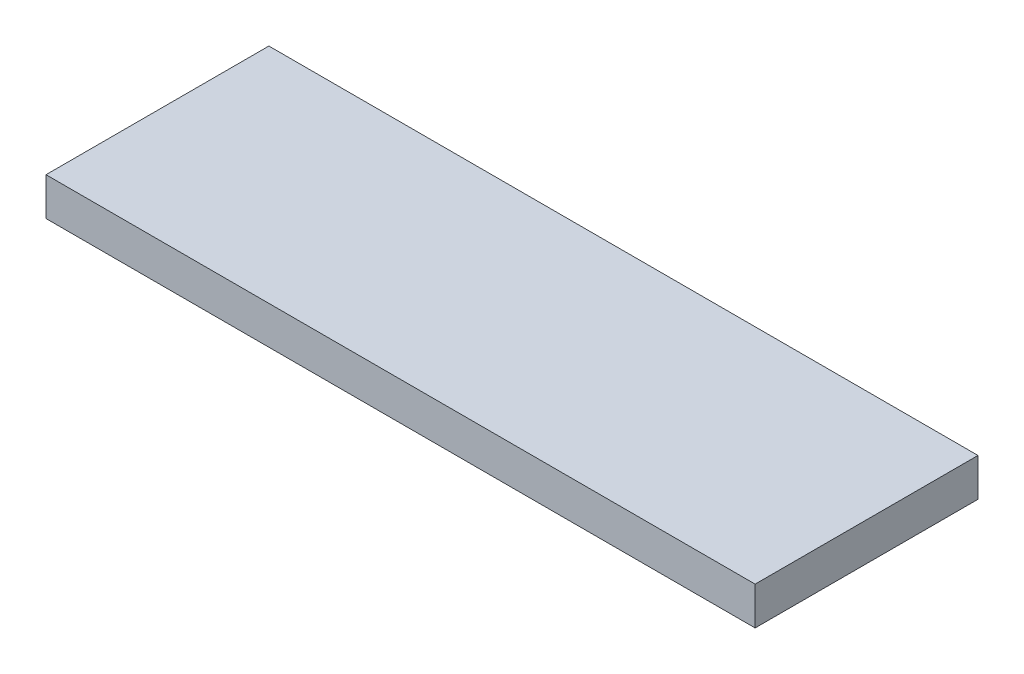
ISO-10303-21;
HEADER;
FILE_DESCRIPTION(('STEP AP214'),'2;1');
FILE_NAME('part.step','',(''),(''),'','','');
FILE_SCHEMA(('AUTOMOTIVE_DESIGN { 1 0 10303 214 1 1 1 1 }'));
ENDSEC;
DATA;
#1=APPLICATION_CONTEXT('core data for automotive mechanical design processes');
#2=APPLICATION_PROTOCOL_DEFINITION('international standard','automotive_design',2000,#1);
#3=PRODUCT_CONTEXT('',#1,'mechanical');
#4=PRODUCT('Part','Part','',(#3));
#5=PRODUCT_RELATED_PRODUCT_CATEGORY('part','',(#4));
#6=PRODUCT_DEFINITION_FORMATION('','',#4);
#7=PRODUCT_DEFINITION_CONTEXT('part definition',#1,'design');
#8=PRODUCT_DEFINITION('design','',#6,#7);
#9=PRODUCT_DEFINITION_SHAPE('','',#8);
#10=(LENGTH_UNIT() NAMED_UNIT(*) SI_UNIT(.MILLI.,.METRE.));
#11=(NAMED_UNIT(*) PLANE_ANGLE_UNIT() SI_UNIT($,.RADIAN.));
#12=(NAMED_UNIT(*) SI_UNIT($,.STERADIAN.) SOLID_ANGLE_UNIT());
#13=UNCERTAINTY_MEASURE_WITH_UNIT(LENGTH_MEASURE(1.E-05),#10,'distance_accuracy_value','');
#14=(GEOMETRIC_REPRESENTATION_CONTEXT(3) GLOBAL_UNCERTAINTY_ASSIGNED_CONTEXT((#13)) GLOBAL_UNIT_ASSIGNED_CONTEXT((#10,
#11,#12)) REPRESENTATION_CONTEXT('',''));
#15=CARTESIAN_POINT('',(0.,0.,0.));
#16=DIRECTION('',(0.,0.,1.));
#17=DIRECTION('',(1.,0.,0.));
#18=AXIS2_PLACEMENT_3D('',#15,#16,#17);
#19=CARTESIAN_POINT('',(0.,9.525,0.));
#20=DIRECTION('',(-1.,0.,0.));
#21=DIRECTION('',(0.,0.,1.));
#22=AXIS2_PLACEMENT_3D('',#19,#20,#21);
#23=PLANE('',#22);
#24=DIRECTION('',(0.,0.,-1.));
#25=VECTOR('',#24,1.);
#26=CARTESIAN_POINT('',(0.,0.,0.));
#27=LINE('',#26,#25);
#28=CARTESIAN_POINT('',(0.,0.,0.));
#29=VERTEX_POINT('',#28);
#30=CARTESIAN_POINT('',(0.,0.,-55.88));
#31=VERTEX_POINT('',#30);
#32=EDGE_CURVE('E102',#29,#31,#27,.T.);
#33=ORIENTED_EDGE('',*,*,#32,.T.);
#34=DIRECTION('',(0.,-1.,0.));
#35=VECTOR('',#34,1.);
#36=CARTESIAN_POINT('',(0.,9.525,-55.88));
#37=LINE('',#36,#35);
#38=CARTESIAN_POINT('',(0.,9.525,-55.88));
#39=VERTEX_POINT('',#38);
#40=EDGE_CURVE('E11',#39,#31,#37,.T.);
#41=ORIENTED_EDGE('',*,*,#40,.F.);
#42=DIRECTION('',(0.,0.,-1.));
#43=VECTOR('',#42,1.);
#44=CARTESIAN_POINT('',(0.,9.525,0.));
#45=LINE('',#44,#43);
#46=CARTESIAN_POINT('',(0.,9.525,0.));
#47=VERTEX_POINT('',#46);
#48=EDGE_CURVE('E90',#47,#39,#45,.T.);
#49=ORIENTED_EDGE('',*,*,#48,.F.);
#50=DIRECTION('',(0.,-1.,0.));
#51=VECTOR('',#50,1.);
#52=CARTESIAN_POINT('',(0.,9.525,0.));
#53=LINE('',#52,#51);
#54=EDGE_CURVE('E98',#47,#29,#53,.T.);
#55=ORIENTED_EDGE('',*,*,#54,.T.);
#56=EDGE_LOOP('',(#33,#41,#49,#55));
#57=FACE_BOUND('',#56,.T.);
#58=ADVANCED_FACE('F39',(#57),#23,.F.);
#59=CARTESIAN_POINT('',(0.,9.525,-55.88));
#60=DIRECTION('',(0.,0.,1.));
#61=DIRECTION('',(1.,0.,0.));
#62=AXIS2_PLACEMENT_3D('',#59,#60,#61);
#63=PLANE('',#62);
#64=DIRECTION('',(-1.,0.,0.));
#65=VECTOR('',#64,1.);
#66=CARTESIAN_POINT('',(0.,0.,-55.88));
#67=LINE('',#66,#65);
#68=CARTESIAN_POINT('',(-177.8,0.,-55.88));
#69=VERTEX_POINT('',#68);
#70=EDGE_CURVE('E94',#31,#69,#67,.T.);
#71=ORIENTED_EDGE('',*,*,#70,.T.);
#72=DIRECTION('',(0.,-1.,0.));
#73=VECTOR('',#72,1.);
#74=CARTESIAN_POINT('',(-177.8,9.525,-55.88));
#75=LINE('',#74,#73);
#76=CARTESIAN_POINT('',(-177.8,9.525,-55.88));
#77=VERTEX_POINT('',#76);
#78=EDGE_CURVE('E47',#77,#69,#75,.T.);
#79=ORIENTED_EDGE('',*,*,#78,.F.);
#80=DIRECTION('',(-1.,0.,0.));
#81=VECTOR('',#80,1.);
#82=CARTESIAN_POINT('',(0.,9.525,-55.88));
#83=LINE('',#82,#81);
#84=EDGE_CURVE('E85',#39,#77,#83,.T.);
#85=ORIENTED_EDGE('',*,*,#84,.F.);
#86=ORIENTED_EDGE('',*,*,#40,.T.);
#87=EDGE_LOOP('',(#71,#79,#85,#86));
#88=FACE_BOUND('',#87,.T.);
#89=ADVANCED_FACE('F93',(#88),#63,.F.);
#90=CARTESIAN_POINT('',(-177.8,9.525,0.));
#91=DIRECTION('',(1.,0.,0.));
#92=DIRECTION('',(0.,0.,-1.));
#93=AXIS2_PLACEMENT_3D('',#90,#91,#92);
#94=PLANE('',#93);
#95=DIRECTION('',(0.,0.,1.));
#96=VECTOR('',#95,1.);
#97=CARTESIAN_POINT('',(-177.8,0.,0.));
#98=LINE('',#97,#96);
#99=CARTESIAN_POINT('',(-177.8,0.,0.));
#100=VERTEX_POINT('',#99);
#101=EDGE_CURVE('E72',#69,#100,#98,.T.);
#102=ORIENTED_EDGE('',*,*,#101,.T.);
#103=DIRECTION('',(0.,-1.,0.));
#104=VECTOR('',#103,1.);
#105=CARTESIAN_POINT('',(-177.8,9.525,0.));
#106=LINE('',#105,#104);
#107=CARTESIAN_POINT('',(-177.8,9.525,0.));
#108=VERTEX_POINT('',#107);
#109=EDGE_CURVE('E95',#108,#100,#106,.T.);
#110=ORIENTED_EDGE('',*,*,#109,.F.);
#111=DIRECTION('',(0.,0.,1.));
#112=VECTOR('',#111,1.);
#113=CARTESIAN_POINT('',(-177.8,9.525,0.));
#114=LINE('',#113,#112);
#115=EDGE_CURVE('E88',#77,#108,#114,.T.);
#116=ORIENTED_EDGE('',*,*,#115,.F.);
#117=ORIENTED_EDGE('',*,*,#78,.T.);
#118=EDGE_LOOP('',(#102,#110,#116,#117));
#119=FACE_BOUND('',#118,.T.);
#120=ADVANCED_FACE('F96',(#119),#94,.F.);
#121=CARTESIAN_POINT('',(0.,9.525,0.));
#122=DIRECTION('',(0.,0.,-1.));
#123=DIRECTION('',(-1.,0.,0.));
#124=AXIS2_PLACEMENT_3D('',#121,#122,#123);
#125=PLANE('',#124);
#126=DIRECTION('',(1.,0.,0.));
#127=VECTOR('',#126,1.);
#128=CARTESIAN_POINT('',(0.,0.,0.));
#129=LINE('',#128,#127);
#130=EDGE_CURVE('E78',#100,#29,#129,.T.);
#131=ORIENTED_EDGE('',*,*,#130,.T.);
#132=ORIENTED_EDGE('',*,*,#54,.F.);
#133=DIRECTION('',(1.,0.,0.));
#134=VECTOR('',#133,1.);
#135=CARTESIAN_POINT('',(0.,9.525,0.));
#136=LINE('',#135,#134);
#137=EDGE_CURVE('E55',#108,#47,#136,.T.);
#138=ORIENTED_EDGE('',*,*,#137,.F.);
#139=ORIENTED_EDGE('',*,*,#109,.T.);
#140=EDGE_LOOP('',(#131,#132,#138,#139));
#141=FACE_BOUND('',#140,.T.);
#142=ADVANCED_FACE('F109',(#141),#125,.F.);
#143=CARTESIAN_POINT('',(0.,9.525,0.));
#144=DIRECTION('',(0.,1.,0.));
#145=DIRECTION('',(0.,0.,1.));
#146=AXIS2_PLACEMENT_3D('',#143,#144,#145);
#147=PLANE('',#146);
#148=ORIENTED_EDGE('',*,*,#48,.T.);
#149=ORIENTED_EDGE('',*,*,#84,.T.);
#150=ORIENTED_EDGE('',*,*,#115,.T.);
#151=ORIENTED_EDGE('',*,*,#137,.T.);
#152=EDGE_LOOP('',(#148,#149,#150,#151));
#153=FACE_BOUND('',#152,.T.);
#154=ADVANCED_FACE('F86',(#153),#147,.T.);
#155=CARTESIAN_POINT('',(0.,0.,0.));
#156=DIRECTION('',(0.,1.,0.));
#157=DIRECTION('',(0.,0.,1.));
#158=AXIS2_PLACEMENT_3D('',#155,#156,#157);
#159=PLANE('',#158);
#160=ORIENTED_EDGE('',*,*,#32,.F.);
#161=ORIENTED_EDGE('',*,*,#130,.F.);
#162=ORIENTED_EDGE('',*,*,#101,.F.);
#163=ORIENTED_EDGE('',*,*,#70,.F.);
#164=EDGE_LOOP('',(#160,#161,#162,#163));
#165=FACE_BOUND('',#164,.T.);
#166=ADVANCED_FACE('F112',(#165),#159,.F.);
#167=CLOSED_SHELL('',(#58,#89,#120,#142,#154,#166));
#168=MANIFOLD_SOLID_BREP('B2',#167);
#169=ADVANCED_BREP_SHAPE_REPRESENTATION('',(#18,#168),#14);
#170=SHAPE_DEFINITION_REPRESENTATION(#9,#169);
ENDSEC;
END-ISO-10303-21;
